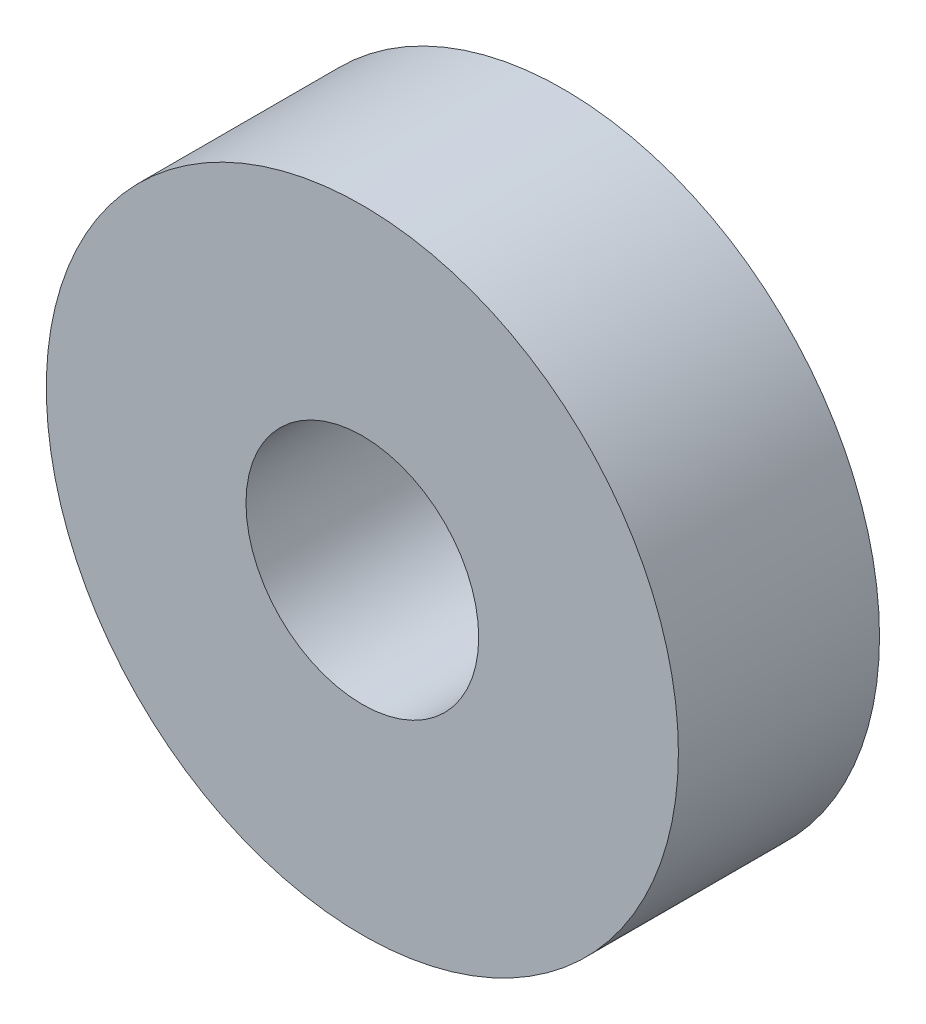
ISO-10303-21;
HEADER;
FILE_DESCRIPTION(('STEP AP214'),'2;1');
FILE_NAME('part.step','',(''),(''),'','','');
FILE_SCHEMA(('AUTOMOTIVE_DESIGN { 1 0 10303 214 1 1 1 1 }'));
ENDSEC;
DATA;
#1=APPLICATION_CONTEXT('core data for automotive mechanical design processes');
#2=APPLICATION_PROTOCOL_DEFINITION('international standard','automotive_design',2000,#1);
#3=PRODUCT_CONTEXT('',#1,'mechanical');
#4=PRODUCT('Part','Part','',(#3));
#5=PRODUCT_RELATED_PRODUCT_CATEGORY('part','',(#4));
#6=PRODUCT_DEFINITION_FORMATION('','',#4);
#7=PRODUCT_DEFINITION_CONTEXT('part definition',#1,'design');
#8=PRODUCT_DEFINITION('design','',#6,#7);
#9=PRODUCT_DEFINITION_SHAPE('','',#8);
#10=(LENGTH_UNIT() NAMED_UNIT(*) SI_UNIT(.MILLI.,.METRE.));
#11=(NAMED_UNIT(*) PLANE_ANGLE_UNIT() SI_UNIT($,.RADIAN.));
#12=(NAMED_UNIT(*) SI_UNIT($,.STERADIAN.) SOLID_ANGLE_UNIT());
#13=UNCERTAINTY_MEASURE_WITH_UNIT(LENGTH_MEASURE(1.E-05),#10,'distance_accuracy_value','');
#14=(GEOMETRIC_REPRESENTATION_CONTEXT(3) GLOBAL_UNCERTAINTY_ASSIGNED_CONTEXT((#13)) GLOBAL_UNIT_ASSIGNED_CONTEXT((#10,
#11,#12)) REPRESENTATION_CONTEXT('',''));
#15=CARTESIAN_POINT('',(0.,0.,0.));
#16=DIRECTION('',(0.,0.,1.));
#17=DIRECTION('',(1.,0.,0.));
#18=AXIS2_PLACEMENT_3D('',#15,#16,#17);
#19=CARTESIAN_POINT('',(0.,0.,7.));
#20=DIRECTION('',(0.,0.,1.));
#21=DIRECTION('',(1.,0.,0.));
#22=AXIS2_PLACEMENT_3D('',#19,#20,#21);
#23=PLANE('',#22);
#24=CARTESIAN_POINT('',(0.,0.,7.));
#25=DIRECTION('',(0.,0.,1.));
#26=DIRECTION('',(1.,0.,0.));
#27=AXIS2_PLACEMENT_3D('',#24,#25,#26);
#28=CIRCLE('',#27,11.);
#29=CARTESIAN_POINT('',(11.,0.,7.));
#30=VERTEX_POINT('',#29);
#31=EDGE_CURVE('E10',#30,#30,#28,.T.);
#32=ORIENTED_EDGE('',*,*,#31,.T.);
#33=EDGE_LOOP('',(#32));
#34=FACE_BOUND('',#33,.T.);
#35=CARTESIAN_POINT('',(0.,0.,7.));
#36=DIRECTION('',(0.,0.,1.));
#37=DIRECTION('',(1.,0.,0.));
#38=AXIS2_PLACEMENT_3D('',#35,#36,#37);
#39=CIRCLE('',#38,4.05);
#40=CARTESIAN_POINT('',(4.05,0.,7.));
#41=VERTEX_POINT('',#40);
#42=EDGE_CURVE('E39',#41,#41,#39,.T.);
#43=ORIENTED_EDGE('',*,*,#42,.F.);
#44=EDGE_LOOP('',(#43));
#45=FACE_BOUND('',#44,.T.);
#46=ADVANCED_FACE('F28',(#34,#45),#23,.T.);
#47=CARTESIAN_POINT('',(0.,0.,0.));
#48=DIRECTION('',(0.,0.,1.));
#49=DIRECTION('',(1.,0.,0.));
#50=AXIS2_PLACEMENT_3D('',#47,#48,#49);
#51=PLANE('',#50);
#52=CARTESIAN_POINT('',(0.,0.,0.));
#53=DIRECTION('',(0.,0.,1.));
#54=DIRECTION('',(1.,0.,0.));
#55=AXIS2_PLACEMENT_3D('',#52,#53,#54);
#56=CIRCLE('',#55,11.);
#57=CARTESIAN_POINT('',(11.,0.,0.));
#58=VERTEX_POINT('',#57);
#59=EDGE_CURVE('E32',#58,#58,#56,.T.);
#60=ORIENTED_EDGE('',*,*,#59,.F.);
#61=EDGE_LOOP('',(#60));
#62=FACE_BOUND('',#61,.T.);
#63=CARTESIAN_POINT('',(0.,0.,0.));
#64=DIRECTION('',(0.,0.,1.));
#65=DIRECTION('',(1.,0.,0.));
#66=AXIS2_PLACEMENT_3D('',#63,#64,#65);
#67=CIRCLE('',#66,4.05);
#68=CARTESIAN_POINT('',(4.05,0.,0.));
#69=VERTEX_POINT('',#68);
#70=EDGE_CURVE('E41',#69,#69,#67,.T.);
#71=ORIENTED_EDGE('',*,*,#70,.T.);
#72=EDGE_LOOP('',(#71));
#73=FACE_BOUND('',#72,.T.);
#74=ADVANCED_FACE('F51',(#62,#73),#51,.F.);
#75=CARTESIAN_POINT('',(0.,0.,7.));
#76=DIRECTION('',(0.,0.,-1.));
#77=DIRECTION('',(-1.,0.,0.));
#78=AXIS2_PLACEMENT_3D('',#75,#76,#77);
#79=CYLINDRICAL_SURFACE('',#78,11.);
#80=ORIENTED_EDGE('',*,*,#31,.F.);
#81=EDGE_LOOP('',(#80));
#82=FACE_BOUND('',#81,.T.);
#83=ORIENTED_EDGE('',*,*,#59,.T.);
#84=EDGE_LOOP('',(#83));
#85=FACE_BOUND('',#84,.T.);
#86=ADVANCED_FACE('F30',(#82,#85),#79,.T.);
#87=CARTESIAN_POINT('',(0.,0.,7.));
#88=DIRECTION('',(0.,0.,-1.));
#89=DIRECTION('',(-1.,0.,0.));
#90=AXIS2_PLACEMENT_3D('',#87,#88,#89);
#91=CYLINDRICAL_SURFACE('',#90,4.05);
#92=ORIENTED_EDGE('',*,*,#42,.T.);
#93=EDGE_LOOP('',(#92));
#94=FACE_BOUND('',#93,.T.);
#95=ORIENTED_EDGE('',*,*,#70,.F.);
#96=EDGE_LOOP('',(#95));
#97=FACE_BOUND('',#96,.T.);
#98=ADVANCED_FACE('F47',(#94,#97),#91,.F.);
#99=CLOSED_SHELL('',(#46,#74,#86,#98));
#100=MANIFOLD_SOLID_BREP('B2',#99);
#101=ADVANCED_BREP_SHAPE_REPRESENTATION('',(#18,#100),#14);
#102=SHAPE_DEFINITION_REPRESENTATION(#9,#101);
ENDSEC;
END-ISO-10303-21;
